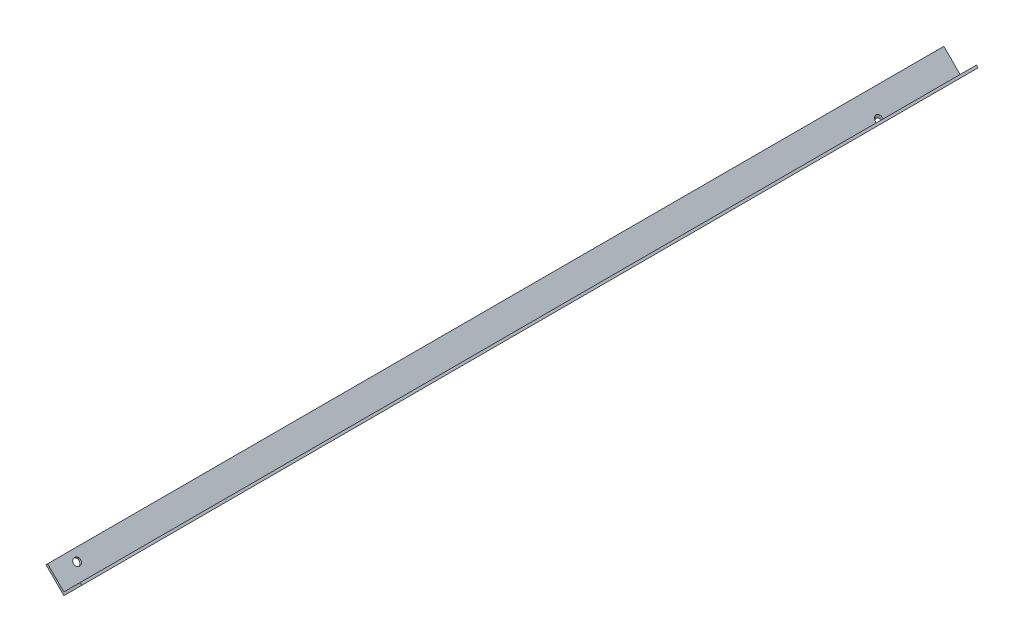
ISO-10303-21;
HEADER;
FILE_DESCRIPTION(('STEP AP214'),'2;1');
FILE_NAME('part.step','',(''),(''),'','','');
FILE_SCHEMA(('AUTOMOTIVE_DESIGN { 1 0 10303 214 1 1 1 1 }'));
ENDSEC;
DATA;
#1=APPLICATION_CONTEXT('core data for automotive mechanical design processes');
#2=APPLICATION_PROTOCOL_DEFINITION('international standard','automotive_design',2000,#1);
#3=PRODUCT_CONTEXT('',#1,'mechanical');
#4=PRODUCT('Part','Part','',(#3));
#5=PRODUCT_RELATED_PRODUCT_CATEGORY('part','',(#4));
#6=PRODUCT_DEFINITION_FORMATION('','',#4);
#7=PRODUCT_DEFINITION_CONTEXT('part definition',#1,'design');
#8=PRODUCT_DEFINITION('design','',#6,#7);
#9=PRODUCT_DEFINITION_SHAPE('','',#8);
#10=(LENGTH_UNIT() NAMED_UNIT(*) SI_UNIT(.MILLI.,.METRE.));
#11=(NAMED_UNIT(*) PLANE_ANGLE_UNIT() SI_UNIT($,.RADIAN.));
#12=(NAMED_UNIT(*) SI_UNIT($,.STERADIAN.) SOLID_ANGLE_UNIT());
#13=UNCERTAINTY_MEASURE_WITH_UNIT(LENGTH_MEASURE(1.E-05),#10,'distance_accuracy_value','');
#14=(GEOMETRIC_REPRESENTATION_CONTEXT(3) GLOBAL_UNCERTAINTY_ASSIGNED_CONTEXT((#13)) GLOBAL_UNIT_ASSIGNED_CONTEXT((#10,
#11,#12)) REPRESENTATION_CONTEXT('',''));
#15=CARTESIAN_POINT('',(0.,0.,0.));
#16=DIRECTION('',(0.,0.,1.));
#17=DIRECTION('',(1.,0.,0.));
#18=AXIS2_PLACEMENT_3D('',#15,#16,#17);
#19=CARTESIAN_POINT('',(8.98025612106916,8.98025612106915,-57.15));
#20=DIRECTION('',(-0.707106781186547,0.707106781186548,0.));
#21=DIRECTION('',(-0.707106781186548,-0.707106781186547,0.));
#22=AXIS2_PLACEMENT_3D('',#19,#20,#21);
#23=PLANE('',#22);
#24=CARTESIAN_POINT('',(0.,0.,-12.7));
#25=DIRECTION('',(-0.707106781186547,0.707106781186548,0.));
#26=DIRECTION('',(0.707106781186548,0.707106781186547,0.));
#27=AXIS2_PLACEMENT_3D('',#24,#25,#26);
#28=ELLIPSE('',#27,2.80633003783411,1.984375);
#29=CARTESIAN_POINT('',(0.,0.,-10.715625));
#30=VERTEX_POINT('',#29);
#31=CARTESIAN_POINT('',(0.,0.,-14.684375));
#32=VERTEX_POINT('',#31);
#33=EDGE_CURVE('E58',#30,#32,#28,.T.);
#34=ORIENTED_EDGE('',*,*,#33,.F.);
#35=DIRECTION('',(0.,0.,1.));
#36=VECTOR('',#35,1.);
#37=CARTESIAN_POINT('',(0.,0.,-57.15));
#38=LINE('',#37,#36);
#39=CARTESIAN_POINT('',(0.,0.,438.15));
#40=VERTEX_POINT('',#39);
#41=EDGE_CURVE('E140',#30,#40,#38,.T.);
#42=ORIENTED_EDGE('',*,*,#41,.T.);
#43=DIRECTION('',(-0.707106781186548,-0.707106781186547,0.));
#44=VECTOR('',#43,1.);
#45=CARTESIAN_POINT('',(8.98025612106916,8.98025612106915,438.15));
#46=LINE('',#45,#44);
#47=CARTESIAN_POINT('',(8.98025612106916,8.98025612106915,438.15));
#48=VERTEX_POINT('',#47);
#49=EDGE_CURVE('E148',#48,#40,#46,.T.);
#50=ORIENTED_EDGE('',*,*,#49,.F.);
#51=DIRECTION('',(0.,0.,1.));
#52=VECTOR('',#51,1.);
#53=CARTESIAN_POINT('',(8.98025612106916,8.98025612106915,-57.15));
#54=LINE('',#53,#52);
#55=CARTESIAN_POINT('',(8.98025612106916,8.98025612106915,-57.15));
#56=VERTEX_POINT('',#55);
#57=EDGE_CURVE('E46',#56,#48,#54,.T.);
#58=ORIENTED_EDGE('',*,*,#57,.F.);
#59=DIRECTION('',(-0.707106781186548,-0.707106781186547,0.));
#60=VECTOR('',#59,1.);
#61=CARTESIAN_POINT('',(8.98025612106916,8.98025612106915,-57.15));
#62=LINE('',#61,#60);
#63=CARTESIAN_POINT('',(0.,0.,-57.15));
#64=VERTEX_POINT('',#63);
#65=EDGE_CURVE('E180',#56,#64,#62,.T.);
#66=ORIENTED_EDGE('',*,*,#65,.T.);
#67=EDGE_CURVE('E136',#64,#32,#38,.T.);
#68=ORIENTED_EDGE('',*,*,#67,.T.);
#69=EDGE_LOOP('',(#34,#42,#50,#58,#66,#68));
#70=FACE_BOUND('',#69,.T.);
#71=CARTESIAN_POINT('',(5.3881536726415,5.38815367264149,431.8));
#72=DIRECTION('',(-0.707106781186547,0.707106781186548,0.));
#73=DIRECTION('',(-0.707106781186548,-0.707106781186547,0.));
#74=AXIS2_PLACEMENT_3D('',#71,#72,#73);
#75=CIRCLE('',#74,1.98437499999999);
#76=CARTESIAN_POINT('',(3.98498865372444,3.98498865372444,431.8));
#77=VERTEX_POINT('',#76);
#78=EDGE_CURVE('E145',#77,#77,#75,.T.);
#79=ORIENTED_EDGE('',*,*,#78,.F.);
#80=EDGE_LOOP('',(#79));
#81=FACE_BOUND('',#80,.T.);
#82=CARTESIAN_POINT('',(5.3881536726415,5.38815367264149,419.1));
#83=DIRECTION('',(-0.707106781186547,0.707106781186548,0.));
#84=DIRECTION('',(-0.707106781186548,-0.707106781186547,0.));
#85=AXIS2_PLACEMENT_3D('',#82,#83,#84);
#86=CIRCLE('',#85,1.98437499999999);
#87=CARTESIAN_POINT('',(3.98498865372444,3.98498865372444,419.1));
#88=VERTEX_POINT('',#87);
#89=EDGE_CURVE('E163',#88,#88,#86,.T.);
#90=ORIENTED_EDGE('',*,*,#89,.F.);
#91=EDGE_LOOP('',(#90));
#92=FACE_BOUND('',#91,.T.);
#93=ADVANCED_FACE('F38',(#70,#81,#92),#23,.T.);
#94=CARTESIAN_POINT('',(9.87828173317607,8.08223050896223,-57.15));
#95=DIRECTION('',(0.707106781186548,0.707106781186547,0.));
#96=DIRECTION('',(-0.707106781186547,0.707106781186548,0.));
#97=AXIS2_PLACEMENT_3D('',#94,#95,#96);
#98=PLANE('',#97);
#99=ORIENTED_EDGE('',*,*,#57,.T.);
#100=DIRECTION('',(-0.707106781186547,0.707106781186548,0.));
#101=VECTOR('',#100,1.);
#102=CARTESIAN_POINT('',(9.87828173317607,8.08223050896223,438.15));
#103=LINE('',#102,#101);
#104=CARTESIAN_POINT('',(9.87828173317607,8.08223050896223,438.15));
#105=VERTEX_POINT('',#104);
#106=EDGE_CURVE('E177',#105,#48,#103,.T.);
#107=ORIENTED_EDGE('',*,*,#106,.F.);
#108=DIRECTION('',(0.,0.,1.));
#109=VECTOR('',#108,1.);
#110=CARTESIAN_POINT('',(9.87828173317607,8.08223050896223,-57.15));
#111=LINE('',#110,#109);
#112=CARTESIAN_POINT('',(9.87828173317607,8.08223050896223,-57.15));
#113=VERTEX_POINT('',#112);
#114=EDGE_CURVE('E123',#113,#105,#111,.T.);
#115=ORIENTED_EDGE('',*,*,#114,.F.);
#116=DIRECTION('',(-0.707106781186547,0.707106781186548,0.));
#117=VECTOR('',#116,1.);
#118=CARTESIAN_POINT('',(9.87828173317607,8.08223050896223,-57.15));
#119=LINE('',#118,#117);
#120=EDGE_CURVE('E197',#113,#56,#119,.T.);
#121=ORIENTED_EDGE('',*,*,#120,.T.);
#122=EDGE_LOOP('',(#99,#107,#115,#121));
#123=FACE_BOUND('',#122,.T.);
#124=ADVANCED_FACE('F203',(#123),#98,.T.);
#125=CARTESIAN_POINT('',(0.,-1.79605122421383,-57.15));
#126=DIRECTION('',(0.707106781186547,-0.707106781186548,0.));
#127=DIRECTION('',(0.707106781186548,0.707106781186547,0.));
#128=AXIS2_PLACEMENT_3D('',#125,#126,#127);
#129=PLANE('',#128);
#130=CARTESIAN_POINT('',(0.,-1.79605122421383,-12.7));
#131=DIRECTION('',(0.707106781186547,-0.707106781186548,0.));
#132=DIRECTION('',(0.707106781186548,0.707106781186547,0.));
#133=AXIS2_PLACEMENT_3D('',#130,#131,#132);
#134=ELLIPSE('',#133,2.80633003783411,1.984375);
#135=CARTESIAN_POINT('',(0.,-1.79605122421383,-14.684375));
#136=VERTEX_POINT('',#135);
#137=CARTESIAN_POINT('',(0.,-1.79605122421383,-10.715625));
#138=VERTEX_POINT('',#137);
#139=EDGE_CURVE('E52',#136,#138,#134,.T.);
#140=ORIENTED_EDGE('',*,*,#139,.F.);
#141=DIRECTION('',(0.,0.,1.));
#142=VECTOR('',#141,1.);
#143=CARTESIAN_POINT('',(0.,-1.79605122421383,-57.15));
#144=LINE('',#143,#142);
#145=CARTESIAN_POINT('',(0.,-1.79605122421383,-57.15));
#146=VERTEX_POINT('',#145);
#147=EDGE_CURVE('E110',#146,#136,#144,.T.);
#148=ORIENTED_EDGE('',*,*,#147,.F.);
#149=DIRECTION('',(0.707106781186548,0.707106781186547,0.));
#150=VECTOR('',#149,1.);
#151=CARTESIAN_POINT('',(0.,-1.79605122421383,-57.15));
#152=LINE('',#151,#150);
#153=EDGE_CURVE('E194',#146,#113,#152,.T.);
#154=ORIENTED_EDGE('',*,*,#153,.T.);
#155=ORIENTED_EDGE('',*,*,#114,.T.);
#156=DIRECTION('',(0.707106781186548,0.707106781186547,0.));
#157=VECTOR('',#156,1.);
#158=CARTESIAN_POINT('',(0.,-1.79605122421383,438.15));
#159=LINE('',#158,#157);
#160=CARTESIAN_POINT('',(0.,-1.79605122421383,438.15));
#161=VERTEX_POINT('',#160);
#162=EDGE_CURVE('E173',#161,#105,#159,.T.);
#163=ORIENTED_EDGE('',*,*,#162,.F.);
#164=EDGE_CURVE('E113',#138,#161,#144,.T.);
#165=ORIENTED_EDGE('',*,*,#164,.F.);
#166=EDGE_LOOP('',(#140,#148,#154,#155,#163,#165));
#167=FACE_BOUND('',#166,.T.);
#168=CARTESIAN_POINT('',(6.28617928474841,4.49012806053457,431.8));
#169=DIRECTION('',(0.707106781186547,-0.707106781186548,0.));
#170=DIRECTION('',(0.707106781186548,0.707106781186547,0.));
#171=AXIS2_PLACEMENT_3D('',#168,#169,#170);
#172=CIRCLE('',#171,1.98437499999999);
#173=CARTESIAN_POINT('',(7.68934430366546,5.89329307945162,431.8));
#174=VERTEX_POINT('',#173);
#175=EDGE_CURVE('E144',#174,#174,#172,.T.);
#176=ORIENTED_EDGE('',*,*,#175,.F.);
#177=EDGE_LOOP('',(#176));
#178=FACE_BOUND('',#177,.T.);
#179=CARTESIAN_POINT('',(6.28617928474841,4.49012806053457,419.1));
#180=DIRECTION('',(0.707106781186547,-0.707106781186548,0.));
#181=DIRECTION('',(0.707106781186548,0.707106781186547,0.));
#182=AXIS2_PLACEMENT_3D('',#179,#180,#181);
#183=CIRCLE('',#182,1.98437499999999);
#184=CARTESIAN_POINT('',(7.68934430366546,5.89329307945162,419.1));
#185=VERTEX_POINT('',#184);
#186=EDGE_CURVE('E141',#185,#185,#183,.T.);
#187=ORIENTED_EDGE('',*,*,#186,.F.);
#188=EDGE_LOOP('',(#187));
#189=FACE_BOUND('',#188,.T.);
#190=ADVANCED_FACE('F107',(#167,#178,#189),#129,.T.);
#191=CARTESIAN_POINT('',(-9.87828173317606,8.08223050896225,-57.15));
#192=DIRECTION('',(-0.707106781186548,-0.707106781186547,0.));
#193=DIRECTION('',(0.707106781186547,-0.707106781186548,0.));
#194=AXIS2_PLACEMENT_3D('',#191,#192,#193);
#195=PLANE('',#194);
#196=CARTESIAN_POINT('',(0.,-1.79605122421383,-12.7));
#197=DIRECTION('',(-0.707106781186548,-0.707106781186547,0.));
#198=DIRECTION('',(-0.707106781186547,0.707106781186548,0.));
#199=AXIS2_PLACEMENT_3D('',#196,#197,#198);
#200=ELLIPSE('',#199,2.80633003783411,1.984375);
#201=EDGE_CURVE('E99',#138,#136,#200,.T.);
#202=ORIENTED_EDGE('',*,*,#201,.F.);
#203=ORIENTED_EDGE('',*,*,#164,.T.);
#204=DIRECTION('',(0.707106781186547,-0.707106781186548,0.));
#205=VECTOR('',#204,1.);
#206=CARTESIAN_POINT('',(-9.87828173317606,8.08223050896225,438.15));
#207=LINE('',#206,#205);
#208=CARTESIAN_POINT('',(-9.87828173317606,8.08223050896225,438.15));
#209=VERTEX_POINT('',#208);
#210=EDGE_CURVE('E169',#209,#161,#207,.T.);
#211=ORIENTED_EDGE('',*,*,#210,.F.);
#212=DIRECTION('',(0.,0.,1.));
#213=VECTOR('',#212,1.);
#214=CARTESIAN_POINT('',(-9.87828173317606,8.08223050896225,-57.15));
#215=LINE('',#214,#213);
#216=CARTESIAN_POINT('',(-9.87828173317606,8.08223050896225,-57.15));
#217=VERTEX_POINT('',#216);
#218=EDGE_CURVE('E128',#217,#209,#215,.T.);
#219=ORIENTED_EDGE('',*,*,#218,.F.);
#220=DIRECTION('',(0.707106781186547,-0.707106781186548,0.));
#221=VECTOR('',#220,1.);
#222=CARTESIAN_POINT('',(-9.87828173317606,8.08223050896225,-57.15));
#223=LINE('',#222,#221);
#224=EDGE_CURVE('E121',#217,#146,#223,.T.);
#225=ORIENTED_EDGE('',*,*,#224,.T.);
#226=ORIENTED_EDGE('',*,*,#147,.T.);
#227=EDGE_LOOP('',(#202,#203,#211,#219,#225,#226));
#228=FACE_BOUND('',#227,.T.);
#229=CARTESIAN_POINT('',(-6.2861792847484,4.49012806053458,425.45));
#230=DIRECTION('',(-0.707106781186548,-0.707106781186547,0.));
#231=DIRECTION('',(0.707106781186547,-0.707106781186548,0.));
#232=AXIS2_PLACEMENT_3D('',#229,#230,#231);
#233=CIRCLE('',#232,1.98437499999999);
#234=CARTESIAN_POINT('',(-4.88301426583135,3.08696304161753,425.45));
#235=VERTEX_POINT('',#234);
#236=EDGE_CURVE('E272',#235,#235,#233,.T.);
#237=ORIENTED_EDGE('',*,*,#236,.F.);
#238=EDGE_LOOP('',(#237));
#239=FACE_BOUND('',#238,.T.);
#240=ADVANCED_FACE('F118',(#228,#239),#195,.T.);
#241=CARTESIAN_POINT('',(-8.98025612106914,8.98025612106916,-57.15));
#242=DIRECTION('',(-0.707106781186547,0.707106781186548,0.));
#243=DIRECTION('',(-0.707106781186548,-0.707106781186547,0.));
#244=AXIS2_PLACEMENT_3D('',#241,#242,#243);
#245=PLANE('',#244);
#246=ORIENTED_EDGE('',*,*,#218,.T.);
#247=DIRECTION('',(-0.707106781186548,-0.707106781186547,0.));
#248=VECTOR('',#247,1.);
#249=CARTESIAN_POINT('',(-8.98025612106914,8.98025612106916,438.15));
#250=LINE('',#249,#248);
#251=CARTESIAN_POINT('',(-8.98025612106914,8.98025612106916,438.15));
#252=VERTEX_POINT('',#251);
#253=EDGE_CURVE('E160',#252,#209,#250,.T.);
#254=ORIENTED_EDGE('',*,*,#253,.F.);
#255=DIRECTION('',(0.,0.,1.));
#256=VECTOR('',#255,1.);
#257=CARTESIAN_POINT('',(-8.98025612106914,8.98025612106916,-57.15));
#258=LINE('',#257,#256);
#259=CARTESIAN_POINT('',(-8.98025612106914,8.98025612106916,-57.15));
#260=VERTEX_POINT('',#259);
#261=EDGE_CURVE('E133',#260,#252,#258,.T.);
#262=ORIENTED_EDGE('',*,*,#261,.F.);
#263=DIRECTION('',(-0.707106781186548,-0.707106781186547,0.));
#264=VECTOR('',#263,1.);
#265=CARTESIAN_POINT('',(-8.98025612106914,8.98025612106916,-57.15));
#266=LINE('',#265,#264);
#267=EDGE_CURVE('E188',#260,#217,#266,.T.);
#268=ORIENTED_EDGE('',*,*,#267,.T.);
#269=EDGE_LOOP('',(#246,#254,#262,#268));
#270=FACE_BOUND('',#269,.T.);
#271=ADVANCED_FACE('F218',(#270),#245,.T.);
#272=CARTESIAN_POINT('',(0.,0.,-57.15));
#273=DIRECTION('',(0.707106781186548,0.707106781186547,0.));
#274=DIRECTION('',(-0.707106781186547,0.707106781186548,0.));
#275=AXIS2_PLACEMENT_3D('',#272,#273,#274);
#276=PLANE('',#275);
#277=CARTESIAN_POINT('',(0.,0.,-12.7));
#278=DIRECTION('',(0.707106781186548,0.707106781186547,0.));
#279=DIRECTION('',(-0.707106781186547,0.707106781186548,0.));
#280=AXIS2_PLACEMENT_3D('',#277,#278,#279);
#281=ELLIPSE('',#280,2.80633003783411,1.984375);
#282=EDGE_CURVE('E11',#32,#30,#281,.T.);
#283=ORIENTED_EDGE('',*,*,#282,.F.);
#284=ORIENTED_EDGE('',*,*,#67,.F.);
#285=DIRECTION('',(-0.707106781186547,0.707106781186548,0.));
#286=VECTOR('',#285,1.);
#287=CARTESIAN_POINT('',(0.,0.,-57.15));
#288=LINE('',#287,#286);
#289=EDGE_CURVE('E184',#64,#260,#288,.T.);
#290=ORIENTED_EDGE('',*,*,#289,.T.);
#291=ORIENTED_EDGE('',*,*,#261,.T.);
#292=DIRECTION('',(-0.707106781186547,0.707106781186548,0.));
#293=VECTOR('',#292,1.);
#294=CARTESIAN_POINT('',(0.,0.,438.15));
#295=LINE('',#294,#293);
#296=EDGE_CURVE('E153',#40,#252,#295,.T.);
#297=ORIENTED_EDGE('',*,*,#296,.F.);
#298=ORIENTED_EDGE('',*,*,#41,.F.);
#299=EDGE_LOOP('',(#283,#284,#290,#291,#297,#298));
#300=FACE_BOUND('',#299,.T.);
#301=CARTESIAN_POINT('',(-5.38815367264149,5.3881536726415,425.45));
#302=DIRECTION('',(0.707106781186548,0.707106781186547,0.));
#303=DIRECTION('',(-0.707106781186547,0.707106781186548,0.));
#304=AXIS2_PLACEMENT_3D('',#301,#302,#303);
#305=CIRCLE('',#304,1.98437499999999);
#306=CARTESIAN_POINT('',(-6.79131869155854,6.79131869155855,425.45));
#307=VERTEX_POINT('',#306);
#308=EDGE_CURVE('E115',#307,#307,#305,.T.);
#309=ORIENTED_EDGE('',*,*,#308,.F.);
#310=EDGE_LOOP('',(#309));
#311=FACE_BOUND('',#310,.T.);
#312=ADVANCED_FACE('F213',(#300,#311),#276,.T.);
#313=CARTESIAN_POINT('',(0.,0.,-57.15));
#314=DIRECTION('',(0.,0.,-1.));
#315=DIRECTION('',(-1.,0.,0.));
#316=AXIS2_PLACEMENT_3D('',#313,#314,#315);
#317=PLANE('',#316);
#318=ORIENTED_EDGE('',*,*,#65,.F.);
#319=ORIENTED_EDGE('',*,*,#120,.F.);
#320=ORIENTED_EDGE('',*,*,#153,.F.);
#321=ORIENTED_EDGE('',*,*,#224,.F.);
#322=ORIENTED_EDGE('',*,*,#267,.F.);
#323=ORIENTED_EDGE('',*,*,#289,.F.);
#324=EDGE_LOOP('',(#318,#319,#320,#321,#322,#323));
#325=FACE_BOUND('',#324,.T.);
#326=ADVANCED_FACE('F221',(#325),#317,.T.);
#327=CARTESIAN_POINT('',(0.,0.,438.15));
#328=DIRECTION('',(0.,0.,-1.));
#329=DIRECTION('',(-1.,0.,0.));
#330=AXIS2_PLACEMENT_3D('',#327,#328,#329);
#331=PLANE('',#330);
#332=ORIENTED_EDGE('',*,*,#49,.T.);
#333=ORIENTED_EDGE('',*,*,#296,.T.);
#334=ORIENTED_EDGE('',*,*,#253,.T.);
#335=ORIENTED_EDGE('',*,*,#210,.T.);
#336=ORIENTED_EDGE('',*,*,#162,.T.);
#337=ORIENTED_EDGE('',*,*,#106,.T.);
#338=EDGE_LOOP('',(#332,#333,#334,#335,#336,#337));
#339=FACE_BOUND('',#338,.T.);
#340=ADVANCED_FACE('F207',(#339),#331,.F.);
#341=CARTESIAN_POINT('',(11.2253201513364,-0.449012806053467,419.1));
#342=DIRECTION('',(-0.707106781186547,0.707106781186548,0.));
#343=DIRECTION('',(-0.707106781186548,-0.707106781186547,0.));
#344=AXIS2_PLACEMENT_3D('',#341,#342,#343);
#345=CYLINDRICAL_SURFACE('',#344,1.98437499999999);
#346=ORIENTED_EDGE('',*,*,#186,.T.);
#347=EDGE_LOOP('',(#346));
#348=FACE_BOUND('',#347,.T.);
#349=ORIENTED_EDGE('',*,*,#89,.T.);
#350=EDGE_LOOP('',(#349));
#351=FACE_BOUND('',#350,.T.);
#352=ADVANCED_FACE('F256',(#348,#351),#345,.F.);
#353=CARTESIAN_POINT('',(11.2253201513364,-0.449012806053467,431.8));
#354=DIRECTION('',(-0.707106781186547,0.707106781186548,0.));
#355=DIRECTION('',(-0.707106781186548,-0.707106781186547,0.));
#356=AXIS2_PLACEMENT_3D('',#353,#354,#355);
#357=CYLINDRICAL_SURFACE('',#356,1.98437499999999);
#358=ORIENTED_EDGE('',*,*,#175,.T.);
#359=EDGE_LOOP('',(#358));
#360=FACE_BOUND('',#359,.T.);
#361=ORIENTED_EDGE('',*,*,#78,.T.);
#362=EDGE_LOOP('',(#361));
#363=FACE_BOUND('',#362,.T.);
#364=ADVANCED_FACE('F229',(#360,#363),#357,.F.);
#365=CARTESIAN_POINT('',(-11.2253201513364,-0.449012806053447,425.45));
#366=DIRECTION('',(0.707106781186548,0.707106781186547,0.));
#367=DIRECTION('',(-0.707106781186547,0.707106781186548,0.));
#368=AXIS2_PLACEMENT_3D('',#365,#366,#367);
#369=CYLINDRICAL_SURFACE('',#368,1.98437499999999);
#370=ORIENTED_EDGE('',*,*,#236,.T.);
#371=EDGE_LOOP('',(#370));
#372=FACE_BOUND('',#371,.T.);
#373=ORIENTED_EDGE('',*,*,#308,.T.);
#374=EDGE_LOOP('',(#373));
#375=FACE_BOUND('',#374,.T.);
#376=ADVANCED_FACE('F224',(#372,#375),#369,.F.);
#377=CARTESIAN_POINT('',(0.,-1.79605122421383,-12.7));
#378=DIRECTION('',(0.,1.,0.));
#379=DIRECTION('',(0.,0.,1.));
#380=AXIS2_PLACEMENT_3D('',#377,#378,#379);
#381=CYLINDRICAL_SURFACE('',#380,1.984375);
#382=ORIENTED_EDGE('',*,*,#139,.T.);
#383=ORIENTED_EDGE('',*,*,#201,.T.);
#384=EDGE_LOOP('',(#382,#383));
#385=FACE_BOUND('',#384,.T.);
#386=ORIENTED_EDGE('',*,*,#33,.T.);
#387=ORIENTED_EDGE('',*,*,#282,.T.);
#388=EDGE_LOOP('',(#386,#387));
#389=FACE_BOUND('',#388,.T.);
#390=ADVANCED_FACE('F100',(#385,#389),#381,.F.);
#391=CLOSED_SHELL('',(#93,#124,#190,#240,#271,#312,#326,#340,#352,#364,#376,#390));
#392=MANIFOLD_SOLID_BREP('B2',#391);
#393=ADVANCED_BREP_SHAPE_REPRESENTATION('',(#18,#392),#14);
#394=SHAPE_DEFINITION_REPRESENTATION(#9,#393);
ENDSEC;
END-ISO-10303-21;
